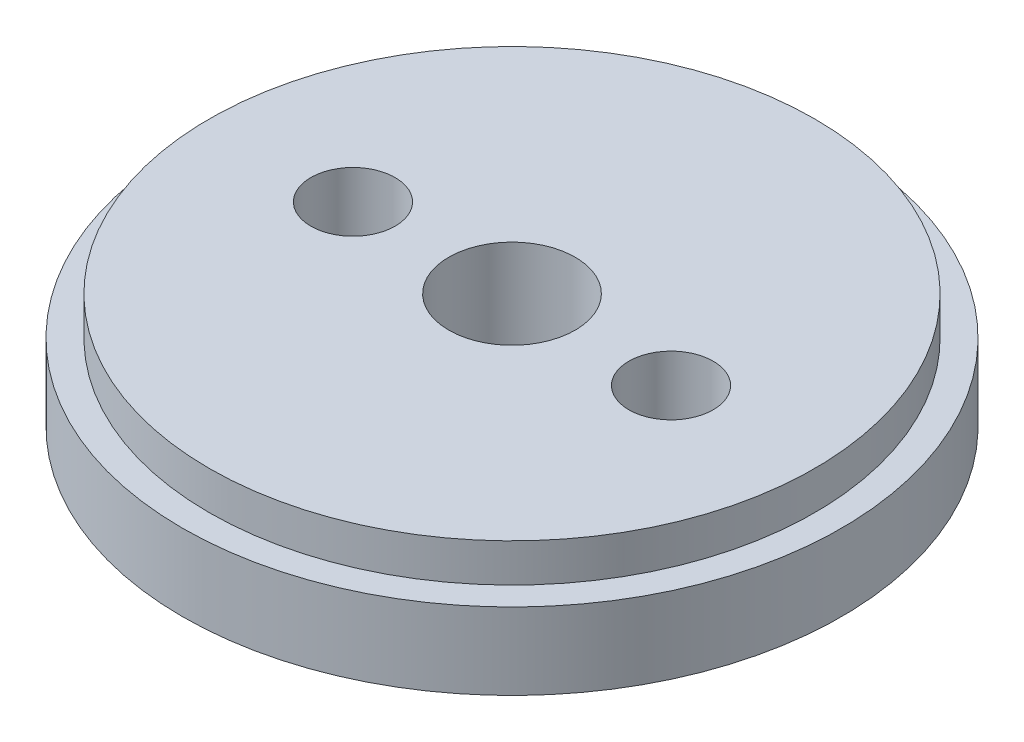
ISO-10303-21;
HEADER;
FILE_DESCRIPTION(('STEP AP214'),'2;1');
FILE_NAME('part.step','',(''),(''),'','','');
FILE_SCHEMA(('AUTOMOTIVE_DESIGN { 1 0 10303 214 1 1 1 1 }'));
ENDSEC;
DATA;
#1=APPLICATION_CONTEXT('core data for automotive mechanical design processes');
#2=APPLICATION_PROTOCOL_DEFINITION('international standard','automotive_design',2000,#1);
#3=PRODUCT_CONTEXT('',#1,'mechanical');
#4=PRODUCT('Part','Part','',(#3));
#5=PRODUCT_RELATED_PRODUCT_CATEGORY('part','',(#4));
#6=PRODUCT_DEFINITION_FORMATION('','',#4);
#7=PRODUCT_DEFINITION_CONTEXT('part definition',#1,'design');
#8=PRODUCT_DEFINITION('design','',#6,#7);
#9=PRODUCT_DEFINITION_SHAPE('','',#8);
#10=(LENGTH_UNIT() NAMED_UNIT(*) SI_UNIT(.MILLI.,.METRE.));
#11=(NAMED_UNIT(*) PLANE_ANGLE_UNIT() SI_UNIT($,.RADIAN.));
#12=(NAMED_UNIT(*) SI_UNIT($,.STERADIAN.) SOLID_ANGLE_UNIT());
#13=UNCERTAINTY_MEASURE_WITH_UNIT(LENGTH_MEASURE(1.E-05),#10,'distance_accuracy_value','');
#14=(GEOMETRIC_REPRESENTATION_CONTEXT(3) GLOBAL_UNCERTAINTY_ASSIGNED_CONTEXT((#13)) GLOBAL_UNIT_ASSIGNED_CONTEXT((#10,
#11,#12)) REPRESENTATION_CONTEXT('',''));
#15=CARTESIAN_POINT('',(0.,0.,0.));
#16=DIRECTION('',(0.,0.,1.));
#17=DIRECTION('',(1.,0.,0.));
#18=AXIS2_PLACEMENT_3D('',#15,#16,#17);
#19=CARTESIAN_POINT('',(0.,0.,0.));
#20=DIRECTION('',(0.,1.,0.));
#21=DIRECTION('',(0.,0.,1.));
#22=AXIS2_PLACEMENT_3D('',#19,#20,#21);
#23=PLANE('',#22);
#24=CARTESIAN_POINT('',(0.,0.,0.));
#25=DIRECTION('',(0.,1.,0.));
#26=DIRECTION('',(0.,0.,1.));
#27=AXIS2_PLACEMENT_3D('',#24,#25,#26);
#28=CIRCLE('',#27,3.3);
#29=CARTESIAN_POINT('',(0.,0.,3.3));
#30=VERTEX_POINT('',#29);
#31=EDGE_CURVE('E64',#30,#30,#28,.T.);
#32=ORIENTED_EDGE('',*,*,#31,.T.);
#33=EDGE_LOOP('',(#32));
#34=FACE_BOUND('',#33,.T.);
#35=CARTESIAN_POINT('',(8.30000000000001,0.,0.));
#36=DIRECTION('',(0.,1.,0.));
#37=DIRECTION('',(0.,0.,1.));
#38=AXIS2_PLACEMENT_3D('',#35,#36,#37);
#39=CIRCLE('',#38,2.2);
#40=CARTESIAN_POINT('',(8.30000000000001,0.,2.2));
#41=VERTEX_POINT('',#40);
#42=EDGE_CURVE('E58',#41,#41,#39,.F.);
#43=ORIENTED_EDGE('',*,*,#42,.F.);
#44=EDGE_LOOP('',(#43));
#45=FACE_BOUND('',#44,.T.);
#46=CARTESIAN_POINT('',(0.,0.,0.));
#47=DIRECTION('',(0.,1.,0.));
#48=DIRECTION('',(0.,0.,1.));
#49=AXIS2_PLACEMENT_3D('',#46,#47,#48);
#50=CIRCLE('',#49,17.2);
#51=CARTESIAN_POINT('',(0.,0.,17.2));
#52=VERTEX_POINT('',#51);
#53=EDGE_CURVE('E11',#52,#52,#50,.T.);
#54=ORIENTED_EDGE('',*,*,#53,.F.);
#55=EDGE_LOOP('',(#54));
#56=FACE_BOUND('',#55,.T.);
#57=CARTESIAN_POINT('',(-8.3,0.,0.));
#58=DIRECTION('',(0.,1.,0.));
#59=DIRECTION('',(0.,0.,1.));
#60=AXIS2_PLACEMENT_3D('',#57,#58,#59);
#61=CIRCLE('',#60,2.2);
#62=CARTESIAN_POINT('',(-8.3,0.,2.2));
#63=VERTEX_POINT('',#62);
#64=EDGE_CURVE('E52',#63,#63,#61,.T.);
#65=ORIENTED_EDGE('',*,*,#64,.T.);
#66=EDGE_LOOP('',(#65));
#67=FACE_BOUND('',#66,.T.);
#68=ADVANCED_FACE('F36',(#34,#45,#56,#67),#23,.F.);
#69=CARTESIAN_POINT('',(0.,6.,0.));
#70=DIRECTION('',(0.,1.,0.));
#71=DIRECTION('',(0.,0.,1.));
#72=AXIS2_PLACEMENT_3D('',#69,#70,#71);
#73=PLANE('',#72);
#74=CARTESIAN_POINT('',(8.30000000000001,6.,0.));
#75=DIRECTION('',(0.,1.,0.));
#76=DIRECTION('',(0.,0.,1.));
#77=AXIS2_PLACEMENT_3D('',#74,#75,#76);
#78=CIRCLE('',#77,2.2);
#79=CARTESIAN_POINT('',(8.30000000000001,6.,2.2));
#80=VERTEX_POINT('',#79);
#81=EDGE_CURVE('E55',#80,#80,#78,.F.);
#82=ORIENTED_EDGE('',*,*,#81,.T.);
#83=EDGE_LOOP('',(#82));
#84=FACE_BOUND('',#83,.T.);
#85=CARTESIAN_POINT('',(0.,6.,0.));
#86=DIRECTION('',(0.,1.,0.));
#87=DIRECTION('',(0.,0.,1.));
#88=AXIS2_PLACEMENT_3D('',#85,#86,#87);
#89=CIRCLE('',#88,15.8);
#90=CARTESIAN_POINT('',(0.,6.,15.8));
#91=VERTEX_POINT('',#90);
#92=EDGE_CURVE('E49',#91,#91,#89,.T.);
#93=ORIENTED_EDGE('',*,*,#92,.T.);
#94=EDGE_LOOP('',(#93));
#95=FACE_BOUND('',#94,.T.);
#96=CARTESIAN_POINT('',(0.,6.,0.));
#97=DIRECTION('',(0.,1.,0.));
#98=DIRECTION('',(0.,0.,1.));
#99=AXIS2_PLACEMENT_3D('',#96,#97,#98);
#100=CIRCLE('',#99,3.3);
#101=CARTESIAN_POINT('',(0.,6.,3.3));
#102=VERTEX_POINT('',#101);
#103=EDGE_CURVE('E61',#102,#102,#100,.T.);
#104=ORIENTED_EDGE('',*,*,#103,.F.);
#105=EDGE_LOOP('',(#104));
#106=FACE_BOUND('',#105,.T.);
#107=CARTESIAN_POINT('',(-8.3,6.,0.));
#108=DIRECTION('',(0.,1.,0.));
#109=DIRECTION('',(0.,0.,1.));
#110=AXIS2_PLACEMENT_3D('',#107,#108,#109);
#111=CIRCLE('',#110,2.2);
#112=CARTESIAN_POINT('',(-8.3,6.,2.2));
#113=VERTEX_POINT('',#112);
#114=EDGE_CURVE('E67',#113,#113,#111,.T.);
#115=ORIENTED_EDGE('',*,*,#114,.F.);
#116=EDGE_LOOP('',(#115));
#117=FACE_BOUND('',#116,.T.);
#118=ADVANCED_FACE('F81',(#84,#95,#106,#117),#73,.T.);
#119=CARTESIAN_POINT('',(0.,6.,0.));
#120=DIRECTION('',(0.,-1.,0.));
#121=DIRECTION('',(0.,0.,-1.));
#122=AXIS2_PLACEMENT_3D('',#119,#120,#121);
#123=CYLINDRICAL_SURFACE('',#122,17.2);
#124=ORIENTED_EDGE('',*,*,#53,.T.);
#125=EDGE_LOOP('',(#124));
#126=FACE_BOUND('',#125,.T.);
#127=CARTESIAN_POINT('',(0.,4.,0.));
#128=DIRECTION('',(0.,1.,0.));
#129=DIRECTION('',(0.,0.,1.));
#130=AXIS2_PLACEMENT_3D('',#127,#128,#129);
#131=CIRCLE('',#130,17.2);
#132=CARTESIAN_POINT('',(0.,4.,17.2));
#133=VERTEX_POINT('',#132);
#134=EDGE_CURVE('E40',#133,#133,#131,.T.);
#135=ORIENTED_EDGE('',*,*,#134,.F.);
#136=EDGE_LOOP('',(#135));
#137=FACE_BOUND('',#136,.T.);
#138=ADVANCED_FACE('F38',(#126,#137),#123,.T.);
#139=CARTESIAN_POINT('',(0.,4.,0.));
#140=DIRECTION('',(0.,1.,0.));
#141=DIRECTION('',(0.,0.,1.));
#142=AXIS2_PLACEMENT_3D('',#139,#140,#141);
#143=PLANE('',#142);
#144=CARTESIAN_POINT('',(0.,4.,0.));
#145=DIRECTION('',(0.,1.,0.));
#146=DIRECTION('',(0.,0.,1.));
#147=AXIS2_PLACEMENT_3D('',#144,#145,#146);
#148=CIRCLE('',#147,15.8);
#149=CARTESIAN_POINT('',(0.,4.,15.8));
#150=VERTEX_POINT('',#149);
#151=EDGE_CURVE('E47',#150,#150,#148,.T.);
#152=ORIENTED_EDGE('',*,*,#151,.F.);
#153=EDGE_LOOP('',(#152));
#154=FACE_BOUND('',#153,.T.);
#155=ORIENTED_EDGE('',*,*,#134,.T.);
#156=EDGE_LOOP('',(#155));
#157=FACE_BOUND('',#156,.T.);
#158=ADVANCED_FACE('F89',(#154,#157),#143,.T.);
#159=CARTESIAN_POINT('',(0.,4.,0.));
#160=DIRECTION('',(0.,1.,0.));
#161=DIRECTION('',(0.,0.,1.));
#162=AXIS2_PLACEMENT_3D('',#159,#160,#161);
#163=CYLINDRICAL_SURFACE('',#162,15.8);
#164=ORIENTED_EDGE('',*,*,#151,.T.);
#165=EDGE_LOOP('',(#164));
#166=FACE_BOUND('',#165,.T.);
#167=ORIENTED_EDGE('',*,*,#92,.F.);
#168=EDGE_LOOP('',(#167));
#169=FACE_BOUND('',#168,.T.);
#170=ADVANCED_FACE('F95',(#166,#169),#163,.T.);
#171=CARTESIAN_POINT('',(8.30000000000001,0.,0.));
#172=DIRECTION('',(0.,1.,0.));
#173=DIRECTION('',(0.,0.,1.));
#174=AXIS2_PLACEMENT_3D('',#171,#172,#173);
#175=CYLINDRICAL_SURFACE('',#174,2.2);
#176=ORIENTED_EDGE('',*,*,#42,.T.);
#177=EDGE_LOOP('',(#176));
#178=FACE_BOUND('',#177,.T.);
#179=ORIENTED_EDGE('',*,*,#81,.F.);
#180=EDGE_LOOP('',(#179));
#181=FACE_BOUND('',#180,.T.);
#182=ADVANCED_FACE('F99',(#178,#181),#175,.F.);
#183=CARTESIAN_POINT('',(0.,0.,0.));
#184=DIRECTION('',(0.,1.,0.));
#185=DIRECTION('',(0.,0.,1.));
#186=AXIS2_PLACEMENT_3D('',#183,#184,#185);
#187=CYLINDRICAL_SURFACE('',#186,3.3);
#188=ORIENTED_EDGE('',*,*,#31,.F.);
#189=EDGE_LOOP('',(#188));
#190=FACE_BOUND('',#189,.T.);
#191=ORIENTED_EDGE('',*,*,#103,.T.);
#192=EDGE_LOOP('',(#191));
#193=FACE_BOUND('',#192,.T.);
#194=ADVANCED_FACE('F77',(#190,#193),#187,.F.);
#195=CARTESIAN_POINT('',(-8.3,0.,0.));
#196=DIRECTION('',(0.,1.,0.));
#197=DIRECTION('',(0.,0.,1.));
#198=AXIS2_PLACEMENT_3D('',#195,#196,#197);
#199=CYLINDRICAL_SURFACE('',#198,2.2);
#200=ORIENTED_EDGE('',*,*,#64,.F.);
#201=EDGE_LOOP('',(#200));
#202=FACE_BOUND('',#201,.T.);
#203=ORIENTED_EDGE('',*,*,#114,.T.);
#204=EDGE_LOOP('',(#203));
#205=FACE_BOUND('',#204,.T.);
#206=ADVANCED_FACE('F74',(#202,#205),#199,.F.);
#207=CLOSED_SHELL('',(#68,#118,#138,#158,#170,#182,#194,#206));
#208=MANIFOLD_SOLID_BREP('B2',#207);
#209=ADVANCED_BREP_SHAPE_REPRESENTATION('',(#18,#208),#14);
#210=SHAPE_DEFINITION_REPRESENTATION(#9,#209);
ENDSEC;
END-ISO-10303-21;
